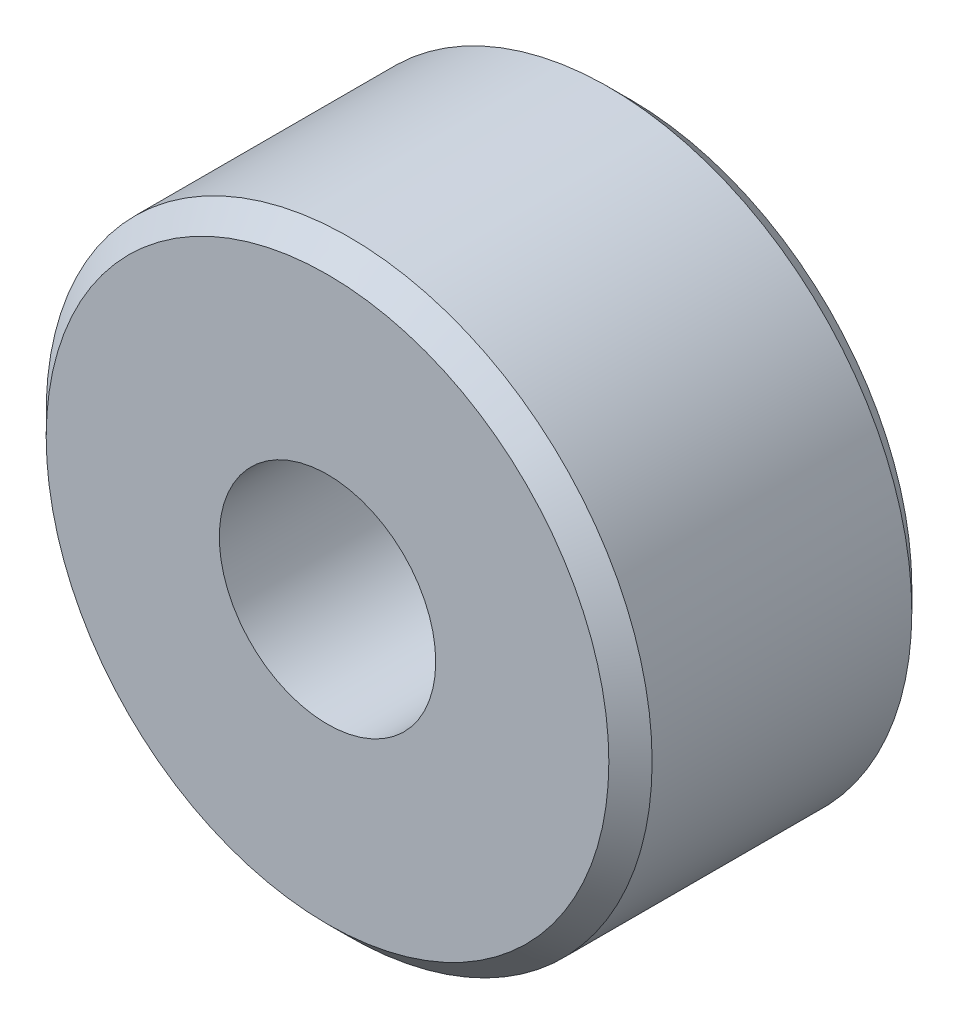
ISO-10303-21;
HEADER;
FILE_DESCRIPTION(('STEP AP214'),'2;1');
FILE_NAME('part.step','',(''),(''),'','','');
FILE_SCHEMA(('AUTOMOTIVE_DESIGN { 1 0 10303 214 1 1 1 1 }'));
ENDSEC;
DATA;
#1=APPLICATION_CONTEXT('core data for automotive mechanical design processes');
#2=APPLICATION_PROTOCOL_DEFINITION('international standard','automotive_design',2000,#1);
#3=PRODUCT_CONTEXT('',#1,'mechanical');
#4=PRODUCT('Part','Part','',(#3));
#5=PRODUCT_RELATED_PRODUCT_CATEGORY('part','',(#4));
#6=PRODUCT_DEFINITION_FORMATION('','',#4);
#7=PRODUCT_DEFINITION_CONTEXT('part definition',#1,'design');
#8=PRODUCT_DEFINITION('design','',#6,#7);
#9=PRODUCT_DEFINITION_SHAPE('','',#8);
#10=(LENGTH_UNIT() NAMED_UNIT(*) SI_UNIT(.MILLI.,.METRE.));
#11=(NAMED_UNIT(*) PLANE_ANGLE_UNIT() SI_UNIT($,.RADIAN.));
#12=(NAMED_UNIT(*) SI_UNIT($,.STERADIAN.) SOLID_ANGLE_UNIT());
#13=UNCERTAINTY_MEASURE_WITH_UNIT(LENGTH_MEASURE(1.E-05),#10,'distance_accuracy_value','');
#14=(GEOMETRIC_REPRESENTATION_CONTEXT(3) GLOBAL_UNCERTAINTY_ASSIGNED_CONTEXT((#13)) GLOBAL_UNIT_ASSIGNED_CONTEXT((#10,
#11,#12)) REPRESENTATION_CONTEXT('',''));
#15=CARTESIAN_POINT('',(0.,0.,0.));
#16=DIRECTION('',(0.,0.,1.));
#17=DIRECTION('',(1.,0.,0.));
#18=AXIS2_PLACEMENT_3D('',#15,#16,#17);
#19=CARTESIAN_POINT('',(0.,0.,1.4));
#20=DIRECTION('',(0.,0.,1.));
#21=DIRECTION('',(1.,0.,0.));
#22=AXIS2_PLACEMENT_3D('',#19,#20,#21);
#23=PLANE('',#22);
#24=CARTESIAN_POINT('',(0.,0.,1.4));
#25=DIRECTION('',(0.,0.,1.));
#26=DIRECTION('',(1.,0.,0.));
#27=AXIS2_PLACEMENT_3D('',#24,#25,#26);
#28=CIRCLE('',#27,1.3);
#29=CARTESIAN_POINT('',(1.3,0.,1.4));
#30=VERTEX_POINT('',#29);
#31=EDGE_CURVE('E10',#30,#30,#28,.T.);
#32=ORIENTED_EDGE('',*,*,#31,.T.);
#33=EDGE_LOOP('',(#32));
#34=FACE_BOUND('',#33,.T.);
#35=CARTESIAN_POINT('',(0.,0.,1.4));
#36=DIRECTION('',(0.,0.,1.));
#37=DIRECTION('',(1.,0.,0.));
#38=AXIS2_PLACEMENT_3D('',#35,#36,#37);
#39=CIRCLE('',#38,0.5);
#40=CARTESIAN_POINT('',(0.5,0.,1.4));
#41=VERTEX_POINT('',#40);
#42=EDGE_CURVE('E57',#41,#41,#39,.T.);
#43=ORIENTED_EDGE('',*,*,#42,.F.);
#44=EDGE_LOOP('',(#43));
#45=FACE_BOUND('',#44,.T.);
#46=ADVANCED_FACE('F31',(#34,#45),#23,.T.);
#47=CARTESIAN_POINT('',(0.,0.,0.));
#48=DIRECTION('',(0.,0.,1.));
#49=DIRECTION('',(1.,0.,0.));
#50=AXIS2_PLACEMENT_3D('',#47,#48,#49);
#51=PLANE('',#50);
#52=CARTESIAN_POINT('',(0.,0.,0.));
#53=DIRECTION('',(0.,0.,1.));
#54=DIRECTION('',(1.,0.,0.));
#55=AXIS2_PLACEMENT_3D('',#52,#53,#54);
#56=CIRCLE('',#55,0.6);
#57=CARTESIAN_POINT('',(0.6,0.,0.));
#58=VERTEX_POINT('',#57);
#59=EDGE_CURVE('E51',#58,#58,#56,.T.);
#60=ORIENTED_EDGE('',*,*,#59,.T.);
#61=EDGE_LOOP('',(#60));
#62=FACE_BOUND('',#61,.T.);
#63=CARTESIAN_POINT('',(0.,0.,0.));
#64=DIRECTION('',(0.,0.,1.));
#65=DIRECTION('',(1.,0.,0.));
#66=AXIS2_PLACEMENT_3D('',#63,#64,#65);
#67=CIRCLE('',#66,1.3);
#68=CARTESIAN_POINT('',(1.3,0.,0.));
#69=VERTEX_POINT('',#68);
#70=EDGE_CURVE('E54',#69,#69,#67,.F.);
#71=ORIENTED_EDGE('',*,*,#70,.T.);
#72=EDGE_LOOP('',(#71));
#73=FACE_BOUND('',#72,.T.);
#74=ADVANCED_FACE('F64',(#62,#73),#51,.F.);
#75=CARTESIAN_POINT('',(0.,0.,1.4));
#76=DIRECTION('',(0.,0.,-1.));
#77=DIRECTION('',(-1.,0.,0.));
#78=AXIS2_PLACEMENT_3D('',#75,#76,#77);
#79=CYLINDRICAL_SURFACE('',#78,1.4);
#80=CARTESIAN_POINT('',(0.,0.,0.100000000000001));
#81=DIRECTION('',(0.,0.,1.));
#82=DIRECTION('',(1.,0.,0.));
#83=AXIS2_PLACEMENT_3D('',#80,#81,#82);
#84=CIRCLE('',#83,1.4);
#85=CARTESIAN_POINT('',(1.4,0.,0.100000000000001));
#86=VERTEX_POINT('',#85);
#87=EDGE_CURVE('E38',#86,#86,#84,.T.);
#88=ORIENTED_EDGE('',*,*,#87,.T.);
#89=EDGE_LOOP('',(#88));
#90=FACE_BOUND('',#89,.T.);
#91=CARTESIAN_POINT('',(0.,0.,1.3));
#92=DIRECTION('',(0.,0.,1.));
#93=DIRECTION('',(1.,0.,0.));
#94=AXIS2_PLACEMENT_3D('',#91,#92,#93);
#95=CIRCLE('',#94,1.4);
#96=CARTESIAN_POINT('',(1.4,0.,1.3));
#97=VERTEX_POINT('',#96);
#98=EDGE_CURVE('E42',#97,#97,#95,.F.);
#99=ORIENTED_EDGE('',*,*,#98,.T.);
#100=EDGE_LOOP('',(#99));
#101=FACE_BOUND('',#100,.T.);
#102=ADVANCED_FACE('F69',(#90,#101),#79,.T.);
#103=CARTESIAN_POINT('',(0.,0.,1.4));
#104=DIRECTION('',(0.,0.,-1.));
#105=DIRECTION('',(-1.,0.,0.));
#106=AXIS2_PLACEMENT_3D('',#103,#104,#105);
#107=CYLINDRICAL_SURFACE('',#106,0.5);
#108=CARTESIAN_POINT('',(0.,0.,0.1));
#109=DIRECTION('',(0.,0.,1.));
#110=DIRECTION('',(1.,0.,0.));
#111=AXIS2_PLACEMENT_3D('',#108,#109,#110);
#112=CIRCLE('',#111,0.5);
#113=CARTESIAN_POINT('',(0.5,0.,0.1));
#114=VERTEX_POINT('',#113);
#115=EDGE_CURVE('E46',#114,#114,#112,.F.);
#116=ORIENTED_EDGE('',*,*,#115,.T.);
#117=EDGE_LOOP('',(#116));
#118=FACE_BOUND('',#117,.T.);
#119=ORIENTED_EDGE('',*,*,#42,.T.);
#120=EDGE_LOOP('',(#119));
#121=FACE_BOUND('',#120,.T.);
#122=ADVANCED_FACE('F61',(#118,#121),#107,.F.);
#123=CARTESIAN_POINT('',(0.,0.,0.));
#124=DIRECTION('',(0.,0.,-1.));
#125=DIRECTION('',(-1.,0.,0.));
#126=AXIS2_PLACEMENT_3D('',#123,#124,#125);
#127=CONICAL_SURFACE('',#126,0.6,0.785398163397447);
#128=ORIENTED_EDGE('',*,*,#115,.F.);
#129=EDGE_LOOP('',(#128));
#130=FACE_BOUND('',#129,.T.);
#131=ORIENTED_EDGE('',*,*,#59,.F.);
#132=EDGE_LOOP('',(#131));
#133=FACE_BOUND('',#132,.T.);
#134=ADVANCED_FACE('F76',(#130,#133),#127,.F.);
#135=CARTESIAN_POINT('',(0.,0.,0.100000000000001));
#136=DIRECTION('',(0.,0.,1.));
#137=DIRECTION('',(1.,0.,0.));
#138=AXIS2_PLACEMENT_3D('',#135,#136,#137);
#139=CONICAL_SURFACE('',#138,1.4,0.78539816339745);
#140=ORIENTED_EDGE('',*,*,#70,.F.);
#141=EDGE_LOOP('',(#140));
#142=FACE_BOUND('',#141,.T.);
#143=ORIENTED_EDGE('',*,*,#87,.F.);
#144=EDGE_LOOP('',(#143));
#145=FACE_BOUND('',#144,.T.);
#146=ADVANCED_FACE('F78',(#142,#145),#139,.T.);
#147=CARTESIAN_POINT('',(0.,0.,1.4));
#148=DIRECTION('',(0.,0.,-1.));
#149=DIRECTION('',(-1.,0.,0.));
#150=AXIS2_PLACEMENT_3D('',#147,#148,#149);
#151=CONICAL_SURFACE('',#150,1.3,0.785398163397446);
#152=ORIENTED_EDGE('',*,*,#98,.F.);
#153=EDGE_LOOP('',(#152));
#154=FACE_BOUND('',#153,.T.);
#155=ORIENTED_EDGE('',*,*,#31,.F.);
#156=EDGE_LOOP('',(#155));
#157=FACE_BOUND('',#156,.T.);
#158=ADVANCED_FACE('F33',(#154,#157),#151,.T.);
#159=CLOSED_SHELL('',(#46,#74,#102,#122,#134,#146,#158));
#160=MANIFOLD_SOLID_BREP('B2',#159);
#161=ADVANCED_BREP_SHAPE_REPRESENTATION('',(#18,#160),#14);
#162=SHAPE_DEFINITION_REPRESENTATION(#9,#161);
ENDSEC;
END-ISO-10303-21;
